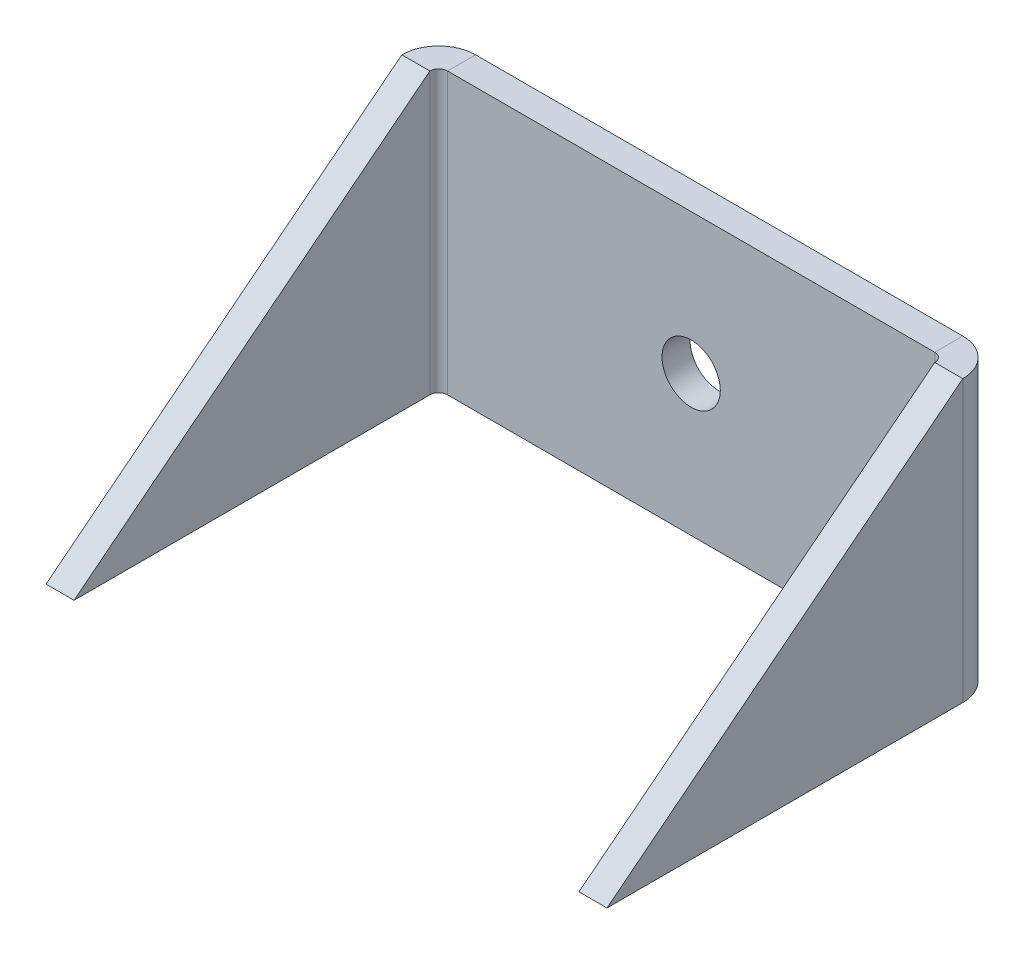
ISO-10303-21;
HEADER;
FILE_DESCRIPTION(('STEP AP214'),'2;1');
FILE_NAME('part.step','',(''),(''),'','','');
FILE_SCHEMA(('AUTOMOTIVE_DESIGN { 1 0 10303 214 1 1 1 1 }'));
ENDSEC;
DATA;
#1=APPLICATION_CONTEXT('core data for automotive mechanical design processes');
#2=APPLICATION_PROTOCOL_DEFINITION('international standard','automotive_design',2000,#1);
#3=PRODUCT_CONTEXT('',#1,'mechanical');
#4=PRODUCT('Part','Part','',(#3));
#5=PRODUCT_RELATED_PRODUCT_CATEGORY('part','',(#4));
#6=PRODUCT_DEFINITION_FORMATION('','',#4);
#7=PRODUCT_DEFINITION_CONTEXT('part definition',#1,'design');
#8=PRODUCT_DEFINITION('design','',#6,#7);
#9=PRODUCT_DEFINITION_SHAPE('','',#8);
#10=(LENGTH_UNIT() NAMED_UNIT(*) SI_UNIT(.MILLI.,.METRE.));
#11=(NAMED_UNIT(*) PLANE_ANGLE_UNIT() SI_UNIT($,.RADIAN.));
#12=(NAMED_UNIT(*) SI_UNIT($,.STERADIAN.) SOLID_ANGLE_UNIT());
#13=UNCERTAINTY_MEASURE_WITH_UNIT(LENGTH_MEASURE(1.E-05),#10,'distance_accuracy_value','');
#14=(GEOMETRIC_REPRESENTATION_CONTEXT(3) GLOBAL_UNCERTAINTY_ASSIGNED_CONTEXT((#13)) GLOBAL_UNIT_ASSIGNED_CONTEXT((#10,
#11,#12)) REPRESENTATION_CONTEXT('',''));
#15=CARTESIAN_POINT('',(0.,0.,0.));
#16=DIRECTION('',(0.,0.,1.));
#17=DIRECTION('',(1.,0.,0.));
#18=AXIS2_PLACEMENT_3D('',#15,#16,#17);
#19=CARTESIAN_POINT('',(-31.75,0.,-1.11966295392247E-13));
#20=DIRECTION('',(1.,0.,0.));
#21=DIRECTION('',(0.,0.,1.));
#22=AXIS2_PLACEMENT_3D('',#19,#20,#21);
#23=PLANE('',#22);
#24=DIRECTION('',(0.,0.619090944115098,-0.785319299975924));
#25=VECTOR('',#24,1.);
#26=CARTESIAN_POINT('',(-31.75,15.875,4.17499999999999));
#27=LINE('',#26,#25);
#28=CARTESIAN_POINT('',(-31.7500000000001,-15.875,44.45));
#29=VERTEX_POINT('',#28);
#30=CARTESIAN_POINT('',(-31.75,15.875,4.17499999999999));
#31=VERTEX_POINT('',#30);
#32=EDGE_CURVE('E129',#29,#31,#27,.T.);
#33=ORIENTED_EDGE('',*,*,#32,.T.);
#34=DIRECTION('',(0.,1.,0.));
#35=VECTOR('',#34,1.);
#36=CARTESIAN_POINT('',(-31.75,0.,4.17499999999999));
#37=LINE('',#36,#35);
#38=CARTESIAN_POINT('',(-31.75,-15.875,4.17499999999999));
#39=VERTEX_POINT('',#38);
#40=EDGE_CURVE('E152',#39,#31,#37,.T.);
#41=ORIENTED_EDGE('',*,*,#40,.F.);
#42=DIRECTION('',(0.,0.,-1.));
#43=VECTOR('',#42,1.);
#44=CARTESIAN_POINT('',(-31.75,-15.875,3.17499999999999));
#45=LINE('',#44,#43);
#46=EDGE_CURVE('E158',#29,#39,#45,.T.);
#47=ORIENTED_EDGE('',*,*,#46,.F.);
#48=EDGE_LOOP('',(#33,#41,#47));
#49=FACE_BOUND('',#48,.T.);
#50=ADVANCED_FACE('F39',(#49),#23,.F.);
#51=CARTESIAN_POINT('',(-28.575,0.,-1.0088084214142E-13));
#52=DIRECTION('',(1.,0.,0.));
#53=DIRECTION('',(0.,0.,1.));
#54=AXIS2_PLACEMENT_3D('',#51,#52,#53);
#55=PLANE('',#54);
#56=DIRECTION('',(0.,-1.,0.));
#57=VECTOR('',#56,1.);
#58=CARTESIAN_POINT('',(-28.575,15.875,4.175));
#59=LINE('',#58,#57);
#60=CARTESIAN_POINT('',(-28.575,15.875,4.175));
#61=VERTEX_POINT('',#60);
#62=CARTESIAN_POINT('',(-28.575,-15.875,4.175));
#63=VERTEX_POINT('',#62);
#64=EDGE_CURVE('E139',#61,#63,#59,.T.);
#65=ORIENTED_EDGE('',*,*,#64,.F.);
#66=DIRECTION('',(0.,0.619090944115098,-0.785319299975924));
#67=VECTOR('',#66,1.);
#68=CARTESIAN_POINT('',(-28.575,15.875,4.175));
#69=LINE('',#68,#67);
#70=CARTESIAN_POINT('',(-28.5750000000001,-15.875,44.45));
#71=VERTEX_POINT('',#70);
#72=EDGE_CURVE('E118',#71,#61,#69,.T.);
#73=ORIENTED_EDGE('',*,*,#72,.F.);
#74=DIRECTION('',(0.,0.,-1.));
#75=VECTOR('',#74,1.);
#76=CARTESIAN_POINT('',(-28.575,-15.875,3.175));
#77=LINE('',#76,#75);
#78=EDGE_CURVE('E148',#71,#63,#77,.T.);
#79=ORIENTED_EDGE('',*,*,#78,.T.);
#80=EDGE_LOOP('',(#65,#73,#79));
#81=FACE_BOUND('',#80,.T.);
#82=ADVANCED_FACE('F147',(#81),#55,.T.);
#83=CARTESIAN_POINT('',(-28.575,15.875,3.175));
#84=DIRECTION('',(0.,-1.,0.));
#85=DIRECTION('',(0.,0.,-1.));
#86=AXIS2_PLACEMENT_3D('',#83,#84,#85);
#87=PLANE('',#86);
#88=DIRECTION('',(0.,0.,-1.));
#89=VECTOR('',#88,1.);
#90=CARTESIAN_POINT('',(-27.575,15.875,3.175));
#91=LINE('',#90,#89);
#92=CARTESIAN_POINT('',(-27.575,15.875,3.175));
#93=VERTEX_POINT('',#92);
#94=CARTESIAN_POINT('',(-27.575,15.875,0.));
#95=VERTEX_POINT('',#94);
#96=EDGE_CURVE('E56',#93,#95,#91,.T.);
#97=ORIENTED_EDGE('',*,*,#96,.F.);
#98=DIRECTION('',(-1.,0.,0.));
#99=VECTOR('',#98,1.);
#100=CARTESIAN_POINT('',(-28.575,15.875,3.175));
#101=LINE('',#100,#99);
#102=CARTESIAN_POINT('',(27.575,15.875,3.175));
#103=VERTEX_POINT('',#102);
#104=EDGE_CURVE('E48',#103,#93,#101,.T.);
#105=ORIENTED_EDGE('',*,*,#104,.F.);
#106=DIRECTION('',(0.,0.,-1.));
#107=VECTOR('',#106,1.);
#108=CARTESIAN_POINT('',(27.575,15.875,3.175));
#109=LINE('',#108,#107);
#110=CARTESIAN_POINT('',(27.575,15.875,0.));
#111=VERTEX_POINT('',#110);
#112=EDGE_CURVE('E207',#103,#111,#109,.T.);
#113=ORIENTED_EDGE('',*,*,#112,.T.);
#114=DIRECTION('',(-1.,0.,0.));
#115=VECTOR('',#114,1.);
#116=CARTESIAN_POINT('',(-28.575,15.875,0.));
#117=LINE('',#116,#115);
#118=EDGE_CURVE('E221',#111,#95,#117,.T.);
#119=ORIENTED_EDGE('',*,*,#118,.T.);
#120=EDGE_LOOP('',(#97,#105,#113,#119));
#121=FACE_BOUND('',#120,.T.);
#122=ADVANCED_FACE('F41',(#121),#87,.F.);
#123=CARTESIAN_POINT('',(-28.575,-15.875,3.175));
#124=DIRECTION('',(0.,1.,0.));
#125=DIRECTION('',(0.,0.,1.));
#126=AXIS2_PLACEMENT_3D('',#123,#124,#125);
#127=PLANE('',#126);
#128=DIRECTION('',(0.,0.,-1.));
#129=VECTOR('',#128,1.);
#130=CARTESIAN_POINT('',(-27.575,-15.875,3.175));
#131=LINE('',#130,#129);
#132=CARTESIAN_POINT('',(-27.575,-15.875,3.175));
#133=VERTEX_POINT('',#132);
#134=CARTESIAN_POINT('',(-27.575,-15.875,0.));
#135=VERTEX_POINT('',#134);
#136=EDGE_CURVE('E167',#133,#135,#131,.T.);
#137=ORIENTED_EDGE('',*,*,#136,.T.);
#138=DIRECTION('',(1.,0.,0.));
#139=VECTOR('',#138,1.);
#140=CARTESIAN_POINT('',(-28.575,-15.875,0.));
#141=LINE('',#140,#139);
#142=CARTESIAN_POINT('',(27.575,-15.875,0.));
#143=VERTEX_POINT('',#142);
#144=EDGE_CURVE('E43',#135,#143,#141,.T.);
#145=ORIENTED_EDGE('',*,*,#144,.T.);
#146=DIRECTION('',(0.,0.,-1.));
#147=VECTOR('',#146,1.);
#148=CARTESIAN_POINT('',(27.575,-15.875,3.175));
#149=LINE('',#148,#147);
#150=CARTESIAN_POINT('',(27.575,-15.875,3.175));
#151=VERTEX_POINT('',#150);
#152=EDGE_CURVE('E218',#151,#143,#149,.T.);
#153=ORIENTED_EDGE('',*,*,#152,.F.);
#154=DIRECTION('',(1.,0.,0.));
#155=VECTOR('',#154,1.);
#156=CARTESIAN_POINT('',(-28.575,-15.875,3.175));
#157=LINE('',#156,#155);
#158=EDGE_CURVE('E11',#133,#151,#157,.T.);
#159=ORIENTED_EDGE('',*,*,#158,.F.);
#160=EDGE_LOOP('',(#137,#145,#153,#159));
#161=FACE_BOUND('',#160,.T.);
#162=ADVANCED_FACE('F227',(#161),#127,.F.);
#163=CARTESIAN_POINT('',(0.,0.,3.175));
#164=DIRECTION('',(0.,0.,1.));
#165=DIRECTION('',(1.,0.,0.));
#166=AXIS2_PLACEMENT_3D('',#163,#164,#165);
#167=PLANE('',#166);
#168=CARTESIAN_POINT('',(0.,0.,3.175));
#169=DIRECTION('',(0.,0.,1.));
#170=DIRECTION('',(1.,0.,0.));
#171=AXIS2_PLACEMENT_3D('',#168,#169,#170);
#172=CIRCLE('',#171,3.29999999999999);
#173=CARTESIAN_POINT('',(3.29999999999999,0.,3.175));
#174=VERTEX_POINT('',#173);
#175=EDGE_CURVE('E297',#174,#174,#172,.T.);
#176=ORIENTED_EDGE('',*,*,#175,.F.);
#177=EDGE_LOOP('',(#176));
#178=FACE_BOUND('',#177,.T.);
#179=ORIENTED_EDGE('',*,*,#104,.T.);
#180=DIRECTION('',(0.,-1.,0.));
#181=VECTOR('',#180,1.);
#182=CARTESIAN_POINT('',(-27.575,-15.875,3.175));
#183=LINE('',#182,#181);
#184=EDGE_CURVE('E62',#133,#93,#183,.F.);
#185=ORIENTED_EDGE('',*,*,#184,.F.);
#186=ORIENTED_EDGE('',*,*,#158,.T.);
#187=DIRECTION('',(0.,1.,0.));
#188=VECTOR('',#187,1.);
#189=CARTESIAN_POINT('',(27.575,15.875,3.175));
#190=LINE('',#189,#188);
#191=EDGE_CURVE('E213',#103,#151,#190,.F.);
#192=ORIENTED_EDGE('',*,*,#191,.F.);
#193=EDGE_LOOP('',(#179,#185,#186,#192));
#194=FACE_BOUND('',#193,.T.);
#195=ADVANCED_FACE('F259',(#178,#194),#167,.T.);
#196=CARTESIAN_POINT('',(0.,0.,0.));
#197=DIRECTION('',(0.,0.,1.));
#198=DIRECTION('',(1.,0.,0.));
#199=AXIS2_PLACEMENT_3D('',#196,#197,#198);
#200=PLANE('',#199);
#201=CARTESIAN_POINT('',(0.,0.,0.));
#202=DIRECTION('',(0.,0.,1.));
#203=DIRECTION('',(1.,0.,0.));
#204=AXIS2_PLACEMENT_3D('',#201,#202,#203);
#205=CIRCLE('',#204,3.3);
#206=CARTESIAN_POINT('',(3.3,0.,0.));
#207=VERTEX_POINT('',#206);
#208=EDGE_CURVE('E294',#207,#207,#205,.T.);
#209=ORIENTED_EDGE('',*,*,#208,.T.);
#210=EDGE_LOOP('',(#209));
#211=FACE_BOUND('',#210,.T.);
#212=DIRECTION('',(0.,-1.,0.));
#213=VECTOR('',#212,1.);
#214=CARTESIAN_POINT('',(-27.575,-15.875,0.));
#215=LINE('',#214,#213);
#216=EDGE_CURVE('E164',#135,#95,#215,.F.);
#217=ORIENTED_EDGE('',*,*,#216,.T.);
#218=ORIENTED_EDGE('',*,*,#118,.F.);
#219=DIRECTION('',(0.,1.,0.));
#220=VECTOR('',#219,1.);
#221=CARTESIAN_POINT('',(27.575,15.875,0.));
#222=LINE('',#221,#220);
#223=EDGE_CURVE('E200',#111,#143,#222,.F.);
#224=ORIENTED_EDGE('',*,*,#223,.T.);
#225=ORIENTED_EDGE('',*,*,#144,.F.);
#226=EDGE_LOOP('',(#217,#218,#224,#225));
#227=FACE_BOUND('',#226,.T.);
#228=ADVANCED_FACE('F232',(#211,#227),#200,.F.);
#229=CARTESIAN_POINT('',(27.575,-15.875,4.175));
#230=DIRECTION('',(0.,-1.,0.));
#231=DIRECTION('',(0.,0.,-1.));
#232=AXIS2_PLACEMENT_3D('',#229,#230,#231);
#233=PLANE('',#232);
#234=DIRECTION('',(1.,0.,0.));
#235=VECTOR('',#234,1.);
#236=CARTESIAN_POINT('',(28.575,-15.875,4.175));
#237=LINE('',#236,#235);
#238=CARTESIAN_POINT('',(28.575,-15.875,4.175));
#239=VERTEX_POINT('',#238);
#240=CARTESIAN_POINT('',(31.75,-15.875,4.17499999999999));
#241=VERTEX_POINT('',#240);
#242=EDGE_CURVE('E178',#239,#241,#237,.T.);
#243=ORIENTED_EDGE('',*,*,#242,.F.);
#244=CARTESIAN_POINT('',(27.575,-15.875,4.175));
#245=DIRECTION('',(0.,1.,0.));
#246=DIRECTION('',(0.,0.,1.));
#247=AXIS2_PLACEMENT_3D('',#244,#245,#246);
#248=CIRCLE('',#247,1.);
#249=EDGE_CURVE('E210',#151,#239,#248,.F.);
#250=ORIENTED_EDGE('',*,*,#249,.F.);
#251=ORIENTED_EDGE('',*,*,#152,.T.);
#252=CARTESIAN_POINT('',(27.575,-15.875,4.175));
#253=DIRECTION('',(0.,1.,0.));
#254=DIRECTION('',(0.,0.,1.));
#255=AXIS2_PLACEMENT_3D('',#252,#253,#254);
#256=CIRCLE('',#255,4.175);
#257=EDGE_CURVE('E203',#143,#241,#256,.F.);
#258=ORIENTED_EDGE('',*,*,#257,.T.);
#259=EDGE_LOOP('',(#243,#250,#251,#258));
#260=FACE_BOUND('',#259,.T.);
#261=ADVANCED_FACE('F238',(#260),#233,.T.);
#262=CARTESIAN_POINT('',(27.575,15.875,4.175));
#263=DIRECTION('',(0.,-1.,0.));
#264=DIRECTION('',(0.,0.,-1.));
#265=AXIS2_PLACEMENT_3D('',#262,#263,#264);
#266=PLANE('',#265);
#267=CARTESIAN_POINT('',(27.575,15.875,4.175));
#268=DIRECTION('',(0.,1.,0.));
#269=DIRECTION('',(0.,0.,1.));
#270=AXIS2_PLACEMENT_3D('',#267,#268,#269);
#271=CIRCLE('',#270,1.);
#272=CARTESIAN_POINT('',(28.575,15.875,4.175));
#273=VERTEX_POINT('',#272);
#274=EDGE_CURVE('E199',#273,#103,#271,.T.);
#275=ORIENTED_EDGE('',*,*,#274,.F.);
#276=DIRECTION('',(1.,0.,0.));
#277=VECTOR('',#276,1.);
#278=CARTESIAN_POINT('',(28.575,15.875,4.175));
#279=LINE('',#278,#277);
#280=CARTESIAN_POINT('',(31.75,15.875,4.17499999999999));
#281=VERTEX_POINT('',#280);
#282=EDGE_CURVE('E183',#273,#281,#279,.T.);
#283=ORIENTED_EDGE('',*,*,#282,.T.);
#284=CARTESIAN_POINT('',(27.575,15.875,4.175));
#285=DIRECTION('',(0.,1.,0.));
#286=DIRECTION('',(0.,0.,1.));
#287=AXIS2_PLACEMENT_3D('',#284,#285,#286);
#288=CIRCLE('',#287,4.175);
#289=EDGE_CURVE('E204',#281,#111,#288,.T.);
#290=ORIENTED_EDGE('',*,*,#289,.T.);
#291=ORIENTED_EDGE('',*,*,#112,.F.);
#292=EDGE_LOOP('',(#275,#283,#290,#291));
#293=FACE_BOUND('',#292,.T.);
#294=ADVANCED_FACE('F257',(#293),#266,.F.);
#295=CARTESIAN_POINT('',(27.575,15.875,4.175));
#296=DIRECTION('',(0.,1.,0.));
#297=DIRECTION('',(1.,0.,0.));
#298=AXIS2_PLACEMENT_3D('',#295,#296,#297);
#299=CYLINDRICAL_SURFACE('',#298,4.175);
#300=ORIENTED_EDGE('',*,*,#223,.F.);
#301=ORIENTED_EDGE('',*,*,#289,.F.);
#302=DIRECTION('',(0.,-1.,0.));
#303=VECTOR('',#302,1.);
#304=CARTESIAN_POINT('',(31.75,0.,4.17499999999999));
#305=LINE('',#304,#303);
#306=EDGE_CURVE('E186',#281,#241,#305,.T.);
#307=ORIENTED_EDGE('',*,*,#306,.T.);
#308=ORIENTED_EDGE('',*,*,#257,.F.);
#309=EDGE_LOOP('',(#300,#301,#307,#308));
#310=FACE_BOUND('',#309,.T.);
#311=ADVANCED_FACE('F239',(#310),#299,.T.);
#312=CARTESIAN_POINT('',(27.575,15.875,4.175));
#313=DIRECTION('',(0.,1.,0.));
#314=DIRECTION('',(1.,0.,0.));
#315=AXIS2_PLACEMENT_3D('',#312,#313,#314);
#316=CYLINDRICAL_SURFACE('',#315,1.);
#317=ORIENTED_EDGE('',*,*,#191,.T.);
#318=ORIENTED_EDGE('',*,*,#249,.T.);
#319=DIRECTION('',(0.,1.,0.));
#320=VECTOR('',#319,1.);
#321=CARTESIAN_POINT('',(28.575,-15.875,4.175));
#322=LINE('',#321,#320);
#323=EDGE_CURVE('E180',#239,#273,#322,.T.);
#324=ORIENTED_EDGE('',*,*,#323,.T.);
#325=ORIENTED_EDGE('',*,*,#274,.T.);
#326=EDGE_LOOP('',(#317,#318,#324,#325));
#327=FACE_BOUND('',#326,.T.);
#328=ADVANCED_FACE('F250',(#327),#316,.F.);
#329=CARTESIAN_POINT('',(31.75,-15.875,3.17499999999999));
#330=DIRECTION('',(0.,1.,0.));
#331=DIRECTION('',(0.,0.,1.));
#332=AXIS2_PLACEMENT_3D('',#329,#330,#331);
#333=PLANE('',#332);
#334=ORIENTED_EDGE('',*,*,#242,.T.);
#335=DIRECTION('',(0.,0.,-1.));
#336=VECTOR('',#335,1.);
#337=CARTESIAN_POINT('',(31.75,-15.875,3.17499999999999));
#338=LINE('',#337,#336);
#339=CARTESIAN_POINT('',(31.7500000000001,-15.875,44.45));
#340=VERTEX_POINT('',#339);
#341=EDGE_CURVE('E191',#340,#241,#338,.T.);
#342=ORIENTED_EDGE('',*,*,#341,.F.);
#343=DIRECTION('',(-1.,0.,0.));
#344=VECTOR('',#343,1.);
#345=CARTESIAN_POINT('',(31.7500000000001,-15.875,44.45));
#346=LINE('',#345,#344);
#347=CARTESIAN_POINT('',(28.5750000000001,-15.875,44.45));
#348=VERTEX_POINT('',#347);
#349=EDGE_CURVE('E194',#340,#348,#346,.T.);
#350=ORIENTED_EDGE('',*,*,#349,.T.);
#351=DIRECTION('',(0.,0.,-1.));
#352=VECTOR('',#351,1.);
#353=CARTESIAN_POINT('',(28.575,-15.875,3.175));
#354=LINE('',#353,#352);
#355=EDGE_CURVE('E190',#348,#239,#354,.T.);
#356=ORIENTED_EDGE('',*,*,#355,.T.);
#357=EDGE_LOOP('',(#334,#342,#350,#356));
#358=FACE_BOUND('',#357,.T.);
#359=ADVANCED_FACE('F246',(#358),#333,.F.);
#360=CARTESIAN_POINT('',(31.75,0.,-1.11966295392247E-13));
#361=DIRECTION('',(-1.,0.,0.));
#362=DIRECTION('',(0.,0.,1.));
#363=AXIS2_PLACEMENT_3D('',#360,#361,#362);
#364=PLANE('',#363);
#365=ORIENTED_EDGE('',*,*,#306,.F.);
#366=DIRECTION('',(0.,0.619090944115098,-0.785319299975924));
#367=VECTOR('',#366,1.);
#368=CARTESIAN_POINT('',(31.75,15.875,4.17499999999999));
#369=LINE('',#368,#367);
#370=EDGE_CURVE('E173',#340,#281,#369,.T.);
#371=ORIENTED_EDGE('',*,*,#370,.F.);
#372=ORIENTED_EDGE('',*,*,#341,.T.);
#373=EDGE_LOOP('',(#365,#371,#372));
#374=FACE_BOUND('',#373,.T.);
#375=ADVANCED_FACE('F243',(#374),#364,.F.);
#376=CARTESIAN_POINT('',(28.575,0.,-1.0088084214142E-13));
#377=DIRECTION('',(-1.,0.,0.));
#378=DIRECTION('',(0.,0.,1.));
#379=AXIS2_PLACEMENT_3D('',#376,#377,#378);
#380=PLANE('',#379);
#381=DIRECTION('',(0.,0.619090944115098,-0.785319299975924));
#382=VECTOR('',#381,1.);
#383=CARTESIAN_POINT('',(28.575,15.875,4.175));
#384=LINE('',#383,#382);
#385=EDGE_CURVE('E175',#348,#273,#384,.T.);
#386=ORIENTED_EDGE('',*,*,#385,.T.);
#387=ORIENTED_EDGE('',*,*,#323,.F.);
#388=ORIENTED_EDGE('',*,*,#355,.F.);
#389=EDGE_LOOP('',(#386,#387,#388));
#390=FACE_BOUND('',#389,.T.);
#391=ADVANCED_FACE('F253',(#390),#380,.T.);
#392=CARTESIAN_POINT('',(28.575,15.875,4.175));
#393=DIRECTION('',(0.,-0.785319299975924,-0.619090944115098));
#394=DIRECTION('',(0.,0.619090944115098,-0.785319299975924));
#395=AXIS2_PLACEMENT_3D('',#392,#393,#394);
#396=PLANE('',#395);
#397=ORIENTED_EDGE('',*,*,#370,.T.);
#398=ORIENTED_EDGE('',*,*,#282,.F.);
#399=ORIENTED_EDGE('',*,*,#385,.F.);
#400=ORIENTED_EDGE('',*,*,#349,.F.);
#401=EDGE_LOOP('',(#397,#398,#399,#400));
#402=FACE_BOUND('',#401,.T.);
#403=ADVANCED_FACE('F255',(#402),#396,.F.);
#404=CARTESIAN_POINT('',(-27.575,15.875,4.175));
#405=DIRECTION('',(0.,1.,0.));
#406=DIRECTION('',(0.,0.,1.));
#407=AXIS2_PLACEMENT_3D('',#404,#405,#406);
#408=PLANE('',#407);
#409=DIRECTION('',(-1.,0.,0.));
#410=VECTOR('',#409,1.);
#411=CARTESIAN_POINT('',(-28.575,15.875,4.175));
#412=LINE('',#411,#410);
#413=EDGE_CURVE('E121',#61,#31,#412,.T.);
#414=ORIENTED_EDGE('',*,*,#413,.F.);
#415=CARTESIAN_POINT('',(-27.575,15.875,4.175));
#416=DIRECTION('',(0.,-1.,0.));
#417=DIRECTION('',(0.,0.,-1.));
#418=AXIS2_PLACEMENT_3D('',#415,#416,#417);
#419=CIRCLE('',#418,1.);
#420=EDGE_CURVE('E136',#93,#61,#419,.F.);
#421=ORIENTED_EDGE('',*,*,#420,.F.);
#422=ORIENTED_EDGE('',*,*,#96,.T.);
#423=CARTESIAN_POINT('',(-27.575,15.875,4.175));
#424=DIRECTION('',(0.,-1.,0.));
#425=DIRECTION('',(0.,0.,-1.));
#426=AXIS2_PLACEMENT_3D('',#423,#424,#425);
#427=CIRCLE('',#426,4.175);
#428=EDGE_CURVE('E138',#95,#31,#427,.F.);
#429=ORIENTED_EDGE('',*,*,#428,.T.);
#430=EDGE_LOOP('',(#414,#421,#422,#429));
#431=FACE_BOUND('',#430,.T.);
#432=ADVANCED_FACE('F135',(#431),#408,.T.);
#433=CARTESIAN_POINT('',(-27.575,-15.875,4.175));
#434=DIRECTION('',(0.,1.,0.));
#435=DIRECTION('',(0.,0.,1.));
#436=AXIS2_PLACEMENT_3D('',#433,#434,#435);
#437=PLANE('',#436);
#438=CARTESIAN_POINT('',(-27.575,-15.875,4.175));
#439=DIRECTION('',(0.,-1.,0.));
#440=DIRECTION('',(0.,0.,-1.));
#441=AXIS2_PLACEMENT_3D('',#438,#439,#440);
#442=CIRCLE('',#441,1.);
#443=EDGE_CURVE('E163',#63,#133,#442,.T.);
#444=ORIENTED_EDGE('',*,*,#443,.F.);
#445=DIRECTION('',(-1.,0.,0.));
#446=VECTOR('',#445,1.);
#447=CARTESIAN_POINT('',(-28.575,-15.875,4.175));
#448=LINE('',#447,#446);
#449=EDGE_CURVE('E149',#63,#39,#448,.T.);
#450=ORIENTED_EDGE('',*,*,#449,.T.);
#451=CARTESIAN_POINT('',(-27.575,-15.875,4.175));
#452=DIRECTION('',(0.,-1.,0.));
#453=DIRECTION('',(0.,0.,-1.));
#454=AXIS2_PLACEMENT_3D('',#451,#452,#453);
#455=CIRCLE('',#454,4.175);
#456=EDGE_CURVE('E145',#39,#135,#455,.T.);
#457=ORIENTED_EDGE('',*,*,#456,.T.);
#458=ORIENTED_EDGE('',*,*,#136,.F.);
#459=EDGE_LOOP('',(#444,#450,#457,#458));
#460=FACE_BOUND('',#459,.T.);
#461=ADVANCED_FACE('F261',(#460),#437,.F.);
#462=CARTESIAN_POINT('',(-27.575,-15.875,4.175));
#463=DIRECTION('',(0.,-1.,0.));
#464=DIRECTION('',(-1.,0.,0.));
#465=AXIS2_PLACEMENT_3D('',#462,#463,#464);
#466=CYLINDRICAL_SURFACE('',#465,4.175);
#467=ORIENTED_EDGE('',*,*,#216,.F.);
#468=ORIENTED_EDGE('',*,*,#456,.F.);
#469=ORIENTED_EDGE('',*,*,#40,.T.);
#470=ORIENTED_EDGE('',*,*,#428,.F.);
#471=EDGE_LOOP('',(#467,#468,#469,#470));
#472=FACE_BOUND('',#471,.T.);
#473=ADVANCED_FACE('F265',(#472),#466,.T.);
#474=CARTESIAN_POINT('',(-27.575,-15.875,4.175));
#475=DIRECTION('',(0.,-1.,0.));
#476=DIRECTION('',(-1.,0.,0.));
#477=AXIS2_PLACEMENT_3D('',#474,#475,#476);
#478=CYLINDRICAL_SURFACE('',#477,1.);
#479=ORIENTED_EDGE('',*,*,#184,.T.);
#480=ORIENTED_EDGE('',*,*,#420,.T.);
#481=ORIENTED_EDGE('',*,*,#64,.T.);
#482=ORIENTED_EDGE('',*,*,#443,.T.);
#483=EDGE_LOOP('',(#479,#480,#481,#482));
#484=FACE_BOUND('',#483,.T.);
#485=ADVANCED_FACE('F142',(#484),#478,.F.);
#486=CARTESIAN_POINT('',(-31.75,-15.875,3.17499999999999));
#487=DIRECTION('',(0.,-1.,0.));
#488=DIRECTION('',(0.,0.,-1.));
#489=AXIS2_PLACEMENT_3D('',#486,#487,#488);
#490=PLANE('',#489);
#491=ORIENTED_EDGE('',*,*,#46,.T.);
#492=ORIENTED_EDGE('',*,*,#449,.F.);
#493=ORIENTED_EDGE('',*,*,#78,.F.);
#494=DIRECTION('',(1.,0.,0.));
#495=VECTOR('',#494,1.);
#496=CARTESIAN_POINT('',(-31.7500000000001,-15.875,44.45));
#497=LINE('',#496,#495);
#498=EDGE_CURVE('E124',#29,#71,#497,.T.);
#499=ORIENTED_EDGE('',*,*,#498,.F.);
#500=EDGE_LOOP('',(#491,#492,#493,#499));
#501=FACE_BOUND('',#500,.T.);
#502=ADVANCED_FACE('F269',(#501),#490,.T.);
#503=CARTESIAN_POINT('',(-28.575,15.875,4.175));
#504=DIRECTION('',(0.,0.785319299975924,0.619090944115098));
#505=DIRECTION('',(0.,-0.619090944115098,0.785319299975924));
#506=AXIS2_PLACEMENT_3D('',#503,#504,#505);
#507=PLANE('',#506);
#508=ORIENTED_EDGE('',*,*,#32,.F.);
#509=ORIENTED_EDGE('',*,*,#498,.T.);
#510=ORIENTED_EDGE('',*,*,#72,.T.);
#511=ORIENTED_EDGE('',*,*,#413,.T.);
#512=EDGE_LOOP('',(#508,#509,#510,#511));
#513=FACE_BOUND('',#512,.T.);
#514=ADVANCED_FACE('F120',(#513),#507,.T.);
#515=CARTESIAN_POINT('',(0.,0.,3.175));
#516=DIRECTION('',(0.,0.,1.));
#517=DIRECTION('',(1.,0.,0.));
#518=AXIS2_PLACEMENT_3D('',#515,#516,#517);
#519=CYLINDRICAL_SURFACE('',#518,3.29999999999999);
#520=ORIENTED_EDGE('',*,*,#208,.F.);
#521=EDGE_LOOP('',(#520));
#522=FACE_BOUND('',#521,.T.);
#523=ORIENTED_EDGE('',*,*,#175,.T.);
#524=EDGE_LOOP('',(#523));
#525=FACE_BOUND('',#524,.T.);
#526=ADVANCED_FACE('F276',(#522,#525),#519,.F.);
#527=CLOSED_SHELL('',(#50,#82,#122,#162,#195,#228,#261,#294,#311,#328,#359,#375,#391,#403,#432,
#461,#473,#485,#502,#514,#526));
#528=MANIFOLD_SOLID_BREP('B2',#527);
#529=ADVANCED_BREP_SHAPE_REPRESENTATION('',(#18,#528),#14);
#530=SHAPE_DEFINITION_REPRESENTATION(#9,#529);
ENDSEC;
END-ISO-10303-21;
